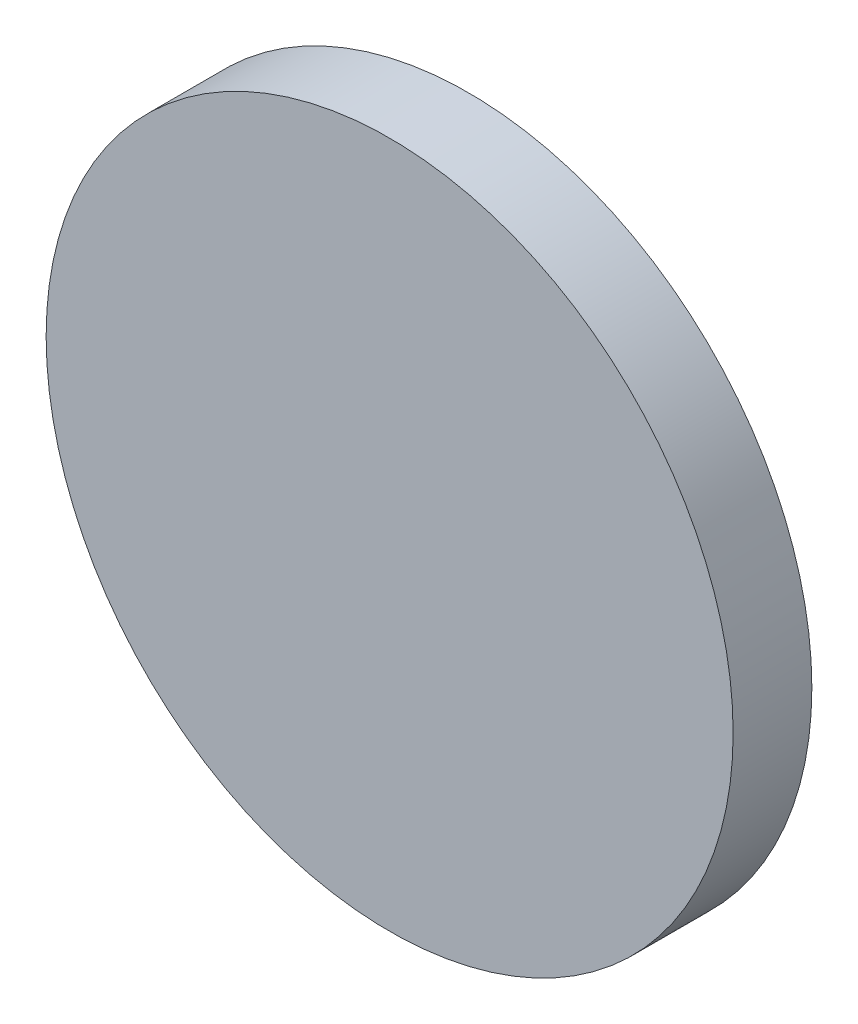
ISO-10303-21;
HEADER;
FILE_DESCRIPTION(('STEP AP214'),'2;1');
FILE_NAME('part.step','',(''),(''),'','','');
FILE_SCHEMA(('AUTOMOTIVE_DESIGN { 1 0 10303 214 1 1 1 1 }'));
ENDSEC;
DATA;
#1=APPLICATION_CONTEXT('core data for automotive mechanical design processes');
#2=APPLICATION_PROTOCOL_DEFINITION('international standard','automotive_design',2000,#1);
#3=PRODUCT_CONTEXT('',#1,'mechanical');
#4=PRODUCT('Part','Part','',(#3));
#5=PRODUCT_RELATED_PRODUCT_CATEGORY('part','',(#4));
#6=PRODUCT_DEFINITION_FORMATION('','',#4);
#7=PRODUCT_DEFINITION_CONTEXT('part definition',#1,'design');
#8=PRODUCT_DEFINITION('design','',#6,#7);
#9=PRODUCT_DEFINITION_SHAPE('','',#8);
#10=(LENGTH_UNIT() NAMED_UNIT(*) SI_UNIT(.MILLI.,.METRE.));
#11=(NAMED_UNIT(*) PLANE_ANGLE_UNIT() SI_UNIT($,.RADIAN.));
#12=(NAMED_UNIT(*) SI_UNIT($,.STERADIAN.) SOLID_ANGLE_UNIT());
#13=UNCERTAINTY_MEASURE_WITH_UNIT(LENGTH_MEASURE(1.E-05),#10,'distance_accuracy_value','');
#14=(GEOMETRIC_REPRESENTATION_CONTEXT(3) GLOBAL_UNCERTAINTY_ASSIGNED_CONTEXT((#13)) GLOBAL_UNIT_ASSIGNED_CONTEXT((#10,
#11,#12)) REPRESENTATION_CONTEXT('',''));
#15=CARTESIAN_POINT('',(0.,0.,0.));
#16=DIRECTION('',(0.,0.,1.));
#17=DIRECTION('',(1.,0.,0.));
#18=AXIS2_PLACEMENT_3D('',#15,#16,#17);
#19=CARTESIAN_POINT('',(0.,0.,10.));
#20=DIRECTION('',(0.,0.,-1.));
#21=DIRECTION('',(-1.,0.,0.));
#22=AXIS2_PLACEMENT_3D('',#19,#20,#21);
#23=CYLINDRICAL_SURFACE('',#22,43.6326191372446);
#24=CARTESIAN_POINT('',(0.,0.,10.));
#25=DIRECTION('',(0.,0.,1.));
#26=DIRECTION('',(1.,0.,0.));
#27=AXIS2_PLACEMENT_3D('',#24,#25,#26);
#28=CIRCLE('',#27,43.6326191372446);
#29=CARTESIAN_POINT('',(43.6326191372446,0.,10.));
#30=VERTEX_POINT('',#29);
#31=EDGE_CURVE('E10',#30,#30,#28,.T.);
#32=ORIENTED_EDGE('',*,*,#31,.F.);
#33=EDGE_LOOP('',(#32));
#34=FACE_BOUND('',#33,.T.);
#35=CARTESIAN_POINT('',(0.,0.,0.));
#36=DIRECTION('',(0.,0.,1.));
#37=DIRECTION('',(1.,0.,0.));
#38=AXIS2_PLACEMENT_3D('',#35,#36,#37);
#39=CIRCLE('',#38,43.6326191372446);
#40=CARTESIAN_POINT('',(43.6326191372446,0.,0.));
#41=VERTEX_POINT('',#40);
#42=EDGE_CURVE('E34',#41,#41,#39,.T.);
#43=ORIENTED_EDGE('',*,*,#42,.T.);
#44=EDGE_LOOP('',(#43));
#45=FACE_BOUND('',#44,.T.);
#46=ADVANCED_FACE('F31',(#34,#45),#23,.T.);
#47=CARTESIAN_POINT('',(0.,0.,10.));
#48=DIRECTION('',(0.,0.,1.));
#49=DIRECTION('',(1.,0.,0.));
#50=AXIS2_PLACEMENT_3D('',#47,#48,#49);
#51=PLANE('',#50);
#52=ORIENTED_EDGE('',*,*,#31,.T.);
#53=EDGE_LOOP('',(#52));
#54=FACE_BOUND('',#53,.T.);
#55=ADVANCED_FACE('F46',(#54),#51,.T.);
#56=CARTESIAN_POINT('',(0.,0.,0.));
#57=DIRECTION('',(0.,0.,1.));
#58=DIRECTION('',(1.,0.,0.));
#59=AXIS2_PLACEMENT_3D('',#56,#57,#58);
#60=PLANE('',#59);
#61=ORIENTED_EDGE('',*,*,#42,.F.);
#62=EDGE_LOOP('',(#61));
#63=FACE_BOUND('',#62,.T.);
#64=ADVANCED_FACE('F44',(#63),#60,.F.);
#65=CLOSED_SHELL('',(#46,#55,#64));
#66=MANIFOLD_SOLID_BREP('B2',#65);
#67=ADVANCED_BREP_SHAPE_REPRESENTATION('',(#18,#66),#14);
#68=SHAPE_DEFINITION_REPRESENTATION(#9,#67);
ENDSEC;
END-ISO-10303-21;
